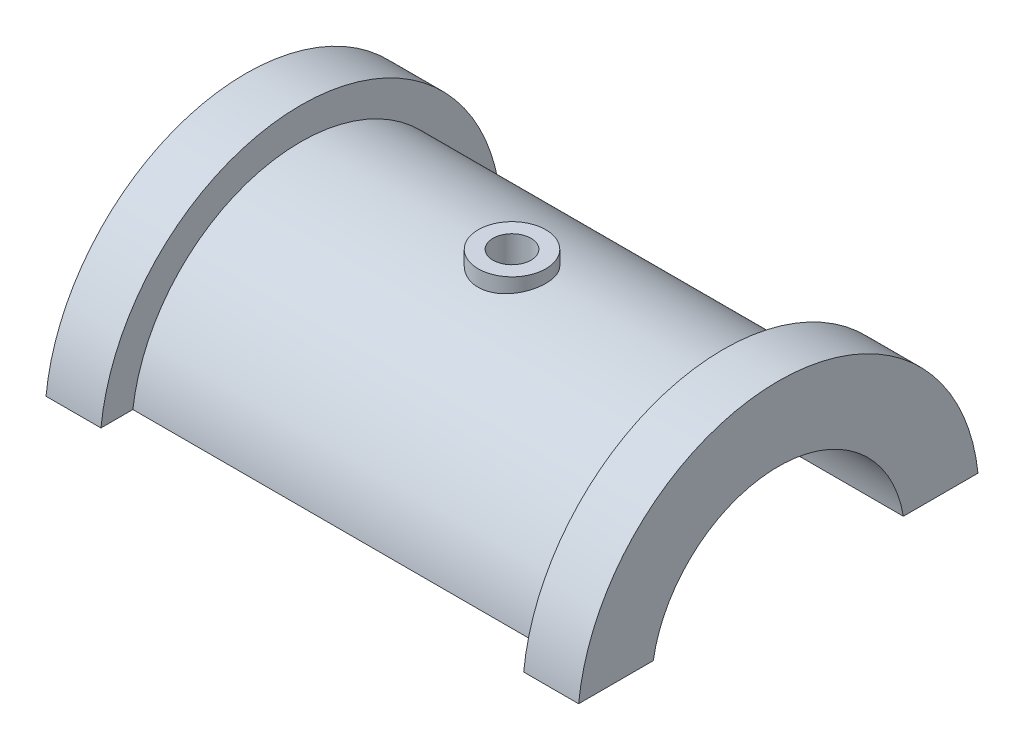
ISO-10303-21;
HEADER;
FILE_DESCRIPTION(('STEP AP214'),'2;1');
FILE_NAME('part.step','',(''),(''),'','','');
FILE_SCHEMA(('AUTOMOTIVE_DESIGN { 1 0 10303 214 1 1 1 1 }'));
ENDSEC;
DATA;
#1=APPLICATION_CONTEXT('core data for automotive mechanical design processes');
#2=APPLICATION_PROTOCOL_DEFINITION('international standard','automotive_design',2000,#1);
#3=PRODUCT_CONTEXT('',#1,'mechanical');
#4=PRODUCT('Part','Part','',(#3));
#5=PRODUCT_RELATED_PRODUCT_CATEGORY('part','',(#4));
#6=PRODUCT_DEFINITION_FORMATION('','',#4);
#7=PRODUCT_DEFINITION_CONTEXT('part definition',#1,'design');
#8=PRODUCT_DEFINITION('design','',#6,#7);
#9=PRODUCT_DEFINITION_SHAPE('','',#8);
#10=(LENGTH_UNIT() NAMED_UNIT(*) SI_UNIT(.MILLI.,.METRE.));
#11=(NAMED_UNIT(*) PLANE_ANGLE_UNIT() SI_UNIT($,.RADIAN.));
#12=(NAMED_UNIT(*) SI_UNIT($,.STERADIAN.) SOLID_ANGLE_UNIT());
#13=UNCERTAINTY_MEASURE_WITH_UNIT(LENGTH_MEASURE(1.E-05),#10,'distance_accuracy_value','');
#14=(GEOMETRIC_REPRESENTATION_CONTEXT(3) GLOBAL_UNCERTAINTY_ASSIGNED_CONTEXT((#13)) GLOBAL_UNIT_ASSIGNED_CONTEXT((#10,
#11,#12)) REPRESENTATION_CONTEXT('',''));
#15=CARTESIAN_POINT('',(0.,0.,0.));
#16=DIRECTION('',(0.,0.,1.));
#17=DIRECTION('',(1.,0.,0.));
#18=AXIS2_PLACEMENT_3D('',#15,#16,#17);
#19=CARTESIAN_POINT('',(0.,0.,0.));
#20=DIRECTION('',(-1.,0.,0.));
#21=DIRECTION('',(0.,0.,1.));
#22=AXIS2_PLACEMENT_3D('',#19,#20,#21);
#23=PLANE('',#22);
#24=CARTESIAN_POINT('',(0.,0.,0.));
#25=DIRECTION('',(1.,0.,0.));
#26=DIRECTION('',(0.,0.,-1.));
#27=AXIS2_PLACEMENT_3D('',#24,#25,#26);
#28=CIRCLE('',#27,47.5);
#29=CARTESIAN_POINT('',(0.,5.,-47.236109069228));
#30=VERTEX_POINT('',#29);
#31=CARTESIAN_POINT('',(0.,5.,47.236109069228));
#32=VERTEX_POINT('',#31);
#33=EDGE_CURVE('E135',#30,#32,#28,.T.);
#34=ORIENTED_EDGE('',*,*,#33,.F.);
#35=DIRECTION('',(0.,0.,1.));
#36=VECTOR('',#35,1.);
#37=CARTESIAN_POINT('',(0.,5.,0.));
#38=LINE('',#37,#36);
#39=CARTESIAN_POINT('',(0.,5.,-29.5803989154981));
#40=VERTEX_POINT('',#39);
#41=EDGE_CURVE('E181',#30,#40,#38,.T.);
#42=ORIENTED_EDGE('',*,*,#41,.T.);
#43=CARTESIAN_POINT('',(0.,0.,0.));
#44=DIRECTION('',(1.,0.,0.));
#45=DIRECTION('',(0.,0.,-1.));
#46=AXIS2_PLACEMENT_3D('',#43,#44,#45);
#47=CIRCLE('',#46,30.);
#48=CARTESIAN_POINT('',(0.,5.,29.5803989154981));
#49=VERTEX_POINT('',#48);
#50=EDGE_CURVE('E114',#40,#49,#47,.T.);
#51=ORIENTED_EDGE('',*,*,#50,.T.);
#52=EDGE_CURVE('E56',#49,#32,#38,.T.);
#53=ORIENTED_EDGE('',*,*,#52,.T.);
#54=EDGE_LOOP('',(#34,#42,#51,#53));
#55=FACE_BOUND('',#54,.T.);
#56=ADVANCED_FACE('F41',(#55),#23,.T.);
#57=CARTESIAN_POINT('',(126.,0.,0.));
#58=DIRECTION('',(1.,0.,0.));
#59=DIRECTION('',(0.,0.,-1.));
#60=AXIS2_PLACEMENT_3D('',#57,#58,#59);
#61=CYLINDRICAL_SURFACE('',#60,47.5);
#62=CARTESIAN_POINT('',(13.,0.,0.));
#63=DIRECTION('',(1.,0.,0.));
#64=DIRECTION('',(0.,0.,-1.));
#65=AXIS2_PLACEMENT_3D('',#62,#63,#64);
#66=CIRCLE('',#65,47.5);
#67=CARTESIAN_POINT('',(13.,5.,-47.236109069228));
#68=VERTEX_POINT('',#67);
#69=CARTESIAN_POINT('',(13.,5.,47.236109069228));
#70=VERTEX_POINT('',#69);
#71=EDGE_CURVE('E183',#68,#70,#66,.T.);
#72=ORIENTED_EDGE('',*,*,#71,.F.);
#73=DIRECTION('',(1.,0.,0.));
#74=VECTOR('',#73,1.);
#75=CARTESIAN_POINT('',(126.,5.,-47.236109069228));
#76=LINE('',#75,#74);
#77=EDGE_CURVE('E63',#68,#30,#76,.F.);
#78=ORIENTED_EDGE('',*,*,#77,.T.);
#79=ORIENTED_EDGE('',*,*,#33,.T.);
#80=DIRECTION('',(1.,0.,0.));
#81=VECTOR('',#80,1.);
#82=CARTESIAN_POINT('',(126.,5.,47.236109069228));
#83=LINE('',#82,#81);
#84=EDGE_CURVE('E200',#32,#70,#83,.T.);
#85=ORIENTED_EDGE('',*,*,#84,.T.);
#86=EDGE_LOOP('',(#72,#78,#79,#85));
#87=FACE_BOUND('',#86,.T.);
#88=ADVANCED_FACE('F175',(#87),#61,.T.);
#89=CARTESIAN_POINT('',(13.,47.5,0.));
#90=DIRECTION('',(1.,0.,0.));
#91=DIRECTION('',(0.,0.,-1.));
#92=AXIS2_PLACEMENT_3D('',#89,#90,#91);
#93=PLANE('',#92);
#94=ORIENTED_EDGE('',*,*,#71,.T.);
#95=DIRECTION('',(0.,0.,-1.));
#96=VECTOR('',#95,1.);
#97=CARTESIAN_POINT('',(13.,5.,0.));
#98=LINE('',#97,#96);
#99=CARTESIAN_POINT('',(13.,5.,39.6862696659689));
#100=VERTEX_POINT('',#99);
#101=EDGE_CURVE('E204',#70,#100,#98,.T.);
#102=ORIENTED_EDGE('',*,*,#101,.T.);
#103=CARTESIAN_POINT('',(13.,0.,0.));
#104=DIRECTION('',(1.,0.,0.));
#105=DIRECTION('',(0.,0.,-1.));
#106=AXIS2_PLACEMENT_3D('',#103,#104,#105);
#107=CIRCLE('',#106,40.);
#108=CARTESIAN_POINT('',(13.,5.,-39.6862696659689));
#109=VERTEX_POINT('',#108);
#110=EDGE_CURVE('E230',#109,#100,#107,.T.);
#111=ORIENTED_EDGE('',*,*,#110,.F.);
#112=EDGE_CURVE('E195',#109,#68,#98,.T.);
#113=ORIENTED_EDGE('',*,*,#112,.T.);
#114=EDGE_LOOP('',(#94,#102,#111,#113));
#115=FACE_BOUND('',#114,.T.);
#116=ADVANCED_FACE('F171',(#115),#93,.T.);
#117=CARTESIAN_POINT('',(126.,0.,0.));
#118=DIRECTION('',(1.,0.,0.));
#119=DIRECTION('',(0.,0.,-1.));
#120=AXIS2_PLACEMENT_3D('',#117,#118,#119);
#121=CYLINDRICAL_SURFACE('',#120,40.);
#122=CARTESIAN_POINT('',(63.,39.1918358845308,8.00000000000001));
#123=CARTESIAN_POINT('',(63.2223321756335,39.1918334625397,8.00000444680971));
#124=CARTESIAN_POINT('',(63.444608835908,39.1937313091331,7.99072915847732));
#125=CARTESIAN_POINT('',(63.8876218461611,39.2012611241478,7.95371066865297));
#126=CARTESIAN_POINT('',(64.1083579293486,39.2068937238825,7.92596434485907));
#127=CARTESIAN_POINT('',(64.5467426101618,39.2217334401668,7.85219908282773));
#128=CARTESIAN_POINT('',(64.7643895368724,39.2309424201119,7.80617061879168));
#129=CARTESIAN_POINT('',(65.1950222828236,39.2526669640111,7.69618591324899));
#130=CARTESIAN_POINT('',(65.4080063551147,39.2651837450381,7.63222307243574));
#131=CARTESIAN_POINT('',(65.8274493151029,39.2931385131023,7.48697016044798));
#132=CARTESIAN_POINT('',(66.0339168198237,39.3085724361382,7.40570417536749));
#133=CARTESIAN_POINT('',(66.4392998991448,39.3419363650496,7.2263655796773));
#134=CARTESIAN_POINT('',(66.6382126172714,39.3598673033238,7.12828668786425));
#135=CARTESIAN_POINT('',(67.0269733163436,39.397704240132,6.91610452763907));
#136=CARTESIAN_POINT('',(67.2168256648899,39.4176092725028,6.80200908681326));
#137=CARTESIAN_POINT('',(67.5863976292983,39.45885578746,6.55850211762383));
#138=CARTESIAN_POINT('',(67.7661125744652,39.4801979224,6.42908361306728));
#139=CARTESIAN_POINT('',(68.1163475643129,39.5239982537687,6.15411905829398));
#140=CARTESIAN_POINT('',(68.2867219720539,39.5464671767086,6.00838917838245));
#141=CARTESIAN_POINT('',(68.6145558470776,39.5916264198183,5.70323504369133));
#142=CARTESIAN_POINT('',(68.7720209523236,39.6143166384428,5.54381683006104));
#143=CARTESIAN_POINT('',(69.0731255690904,39.6593075766281,5.21222816318059));
#144=CARTESIAN_POINT('',(69.2167585566595,39.6816081083725,5.04005175958521));
#145=CARTESIAN_POINT('',(69.4890779153666,39.7251817805114,4.68423328108786));
#146=CARTESIAN_POINT('',(69.6177695234903,39.7464552793466,4.50059525841972));
#147=CARTESIAN_POINT('',(69.8604385628062,39.7875757512423,4.12134830205592));
#148=CARTESIAN_POINT('',(69.9742743191797,39.8074082874115,3.9256471048012));
#149=CARTESIAN_POINT('',(70.1850268139663,39.8448723364328,3.52513751300382));
#150=CARTESIAN_POINT('',(70.2819438193739,39.8625038840172,3.32032926224338));
#151=CARTESIAN_POINT('',(70.4581198398941,39.8950630092,2.90305593566496));
#152=CARTESIAN_POINT('',(70.53737974556,39.9099907231617,2.69059124663517));
#153=CARTESIAN_POINT('',(70.6776238263456,39.9367144918616,2.25952656075932));
#154=CARTESIAN_POINT('',(70.7386086427421,39.9485106564848,2.04092677948937));
#155=CARTESIAN_POINT('',(70.8411442200041,39.968500666972,1.60205405924747));
#156=CARTESIAN_POINT('',(70.8829370426857,39.9767392987482,1.38183970161488));
#157=CARTESIAN_POINT('',(70.9478964723546,39.9895991805319,0.938658138720008));
#158=CARTESIAN_POINT('',(70.9710700229672,39.9942217790381,0.71569199120012));
#159=CARTESIAN_POINT('',(70.9986294212179,39.9997236189696,0.268533421487429));
#160=CARTESIAN_POINT('',(71.0030134240166,40.0006024928197,0.0443408810457438));
#161=CARTESIAN_POINT('',(70.9929526451097,39.9985908186422,-0.403603341337231));
#162=CARTESIAN_POINT('',(70.9785080101147,39.9957002999853,-0.62735502670001));
#163=CARTESIAN_POINT('',(70.9312528162061,39.9863007335844,-1.06956007208301));
#164=CARTESIAN_POINT('',(70.898710480689,39.9798445416014,-1.28804328418386));
#165=CARTESIAN_POINT('',(70.815693779263,39.9635260481262,-1.72152458521656));
#166=CARTESIAN_POINT('',(70.7652131936329,39.9536625652588,-1.93652143825458));
#167=CARTESIAN_POINT('',(70.6467312731468,39.9308042118727,-2.36138127795778));
#168=CARTESIAN_POINT('',(70.578735799815,39.9178103890461,-2.57124595647658));
#169=CARTESIAN_POINT('',(70.4256993844492,39.8890381591941,-2.98455504865933));
#170=CARTESIAN_POINT('',(70.3406521030243,39.8732587168138,-3.18799704189115));
#171=CARTESIAN_POINT('',(70.1535815531641,39.8392422414482,-3.58822554317844));
#172=CARTESIAN_POINT('',(70.0514580411962,39.8209908249741,-3.78496396602225));
#173=CARTESIAN_POINT('',(69.8313331372257,39.7826013735344,-4.16916132193276));
#174=CARTESIAN_POINT('',(69.7133311706324,39.7624632703036,-4.35661991885613));
#175=CARTESIAN_POINT('',(69.4622650477018,39.7208452652347,-4.72102648822367));
#176=CARTESIAN_POINT('',(69.3291996857128,39.6993652560542,-4.89797361761499));
#177=CARTESIAN_POINT('',(69.0489183958665,39.6556459734977,-5.24018167605238));
#178=CARTESIAN_POINT('',(68.9017023042098,39.633406691335,-5.4054424697869));
#179=CARTESIAN_POINT('',(68.5914120240961,39.5883811586584,-5.72596974492621));
#180=CARTESIAN_POINT('',(68.4281058067676,39.5655921383058,-5.88101130801579));
#181=CARTESIAN_POINT('',(68.0889749342266,39.5204937891078,-6.17680825803358));
#182=CARTESIAN_POINT('',(67.9131505079723,39.4981844514987,-6.31756390613739));
#183=CARTESIAN_POINT('',(67.5501298503129,39.4546728448073,-6.58384395745569));
#184=CARTESIAN_POINT('',(67.3629310294606,39.4334708298717,-6.70936487275157));
#185=CARTESIAN_POINT('',(66.9785465601245,39.3927954039874,-6.94419699330226));
#186=CARTESIAN_POINT('',(66.7813647422252,39.3733213377838,-7.05351435373698));
#187=CARTESIAN_POINT('',(66.3777946736904,39.3366117286613,-7.25544915790509));
#188=CARTESIAN_POINT('',(66.171384356556,39.3193819842128,-7.34802357467671));
#189=CARTESIAN_POINT('',(65.7513534289703,39.287734887423,-7.5153938362461));
#190=CARTESIAN_POINT('',(65.5377354634626,39.2733165162983,-7.59019612345057));
#191=CARTESIAN_POINT('',(65.1047331866939,39.2477157945947,-7.72148193065287));
#192=CARTESIAN_POINT('',(64.8853484356048,39.2365336916291,-7.77796404897822));
#193=CARTESIAN_POINT('',(64.4424332263762,39.2177468212383,-7.87214359315173));
#194=CARTESIAN_POINT('',(64.2189028350496,39.2101419962123,-7.90984132146431));
#195=CARTESIAN_POINT('',(63.7732050538516,39.1988401365669,-7.96565933677234));
#196=CARTESIAN_POINT('',(63.5510798499128,39.1950784266016,-7.98410375513831));
#197=CARTESIAN_POINT('',(63.106033935144,39.1913476849508,-8.0023968461039));
#198=CARTESIAN_POINT('',(62.8831132322512,39.1913786155281,-8.0022457037312));
#199=CARTESIAN_POINT('',(62.4381071421417,39.1952321147503,-7.98334963144252));
#200=CARTESIAN_POINT('',(62.2160217105626,39.1990544790899,-7.96460570341782));
#201=CARTESIAN_POINT('',(61.7742810037128,39.2103766066046,-7.90867741066269));
#202=CARTESIAN_POINT('',(61.5546257232514,39.2178763619237,-7.87149308532674));
#203=CARTESIAN_POINT('',(61.1214518779295,39.236240519964,-7.77943482948001));
#204=CARTESIAN_POINT('',(60.9078942926771,39.2470712742881,-7.72473759003573));
#205=CARTESIAN_POINT('',(60.4861106947254,39.2718130151192,-7.59795179367917));
#206=CARTESIAN_POINT('',(60.2778865269745,39.2857250518757,-7.52585730619399));
#207=CARTESIAN_POINT('',(59.86832010563,39.3162271950907,-7.36484795633877));
#208=CARTESIAN_POINT('',(59.6669759242795,39.3328165437915,-7.27593785206036));
#209=CARTESIAN_POINT('',(59.272381200041,39.3682169806381,-7.08189353673638));
#210=CARTESIAN_POINT('',(59.0791335525388,39.3870288545441,-6.9767535836758));
#211=CARTESIAN_POINT('',(58.6996498158305,39.4266019269176,-6.74955710289022));
#212=CARTESIAN_POINT('',(58.513535808138,39.4473850769299,-6.62730047099552));
#213=CARTESIAN_POINT('',(58.1522264276141,39.4901091488608,-6.36777572580048));
#214=CARTESIAN_POINT('',(57.9770312061261,39.5120500868195,-6.23050740449844));
#215=CARTESIAN_POINT('',(57.6386788791504,39.5564864944536,-5.94185978392723));
#216=CARTESIAN_POINT('',(57.4755247651194,39.5789821000894,-5.79047699910403));
#217=CARTESIAN_POINT('',(57.162436340226,39.6238961799814,-5.47469375684461));
#218=CARTESIAN_POINT('',(57.0124979112311,39.6463146761582,-5.31029738509047));
#219=CARTESIAN_POINT('',(56.7245669025983,39.6908114021731,-4.96688279801154));
#220=CARTESIAN_POINT('',(56.5867963171702,39.7128789212228,-4.78767697548575));
#221=CARTESIAN_POINT('',(56.3268441846796,39.7556859639914,-4.41814700095319));
#222=CARTESIAN_POINT('',(56.2046624725018,39.7764255017748,-4.22782296674027));
#223=CARTESIAN_POINT('',(55.9767722477412,39.8159908860153,-3.83736479359661));
#224=CARTESIAN_POINT('',(55.8710636510933,39.8348167422381,-3.63723070473507));
#225=CARTESIAN_POINT('',(55.67691223777,39.8700200050484,-3.22855396209364));
#226=CARTESIAN_POINT('',(55.5884688581965,39.8863974914561,-3.02001158271699));
#227=CARTESIAN_POINT('',(55.4299669944458,39.9161542481918,-2.5971707431593));
#228=CARTESIAN_POINT('',(55.3598091817034,39.9295496568498,-2.38291066058593));
#229=CARTESIAN_POINT('',(55.2378115869592,39.9530722705058,-1.9491458974506));
#230=CARTESIAN_POINT('',(55.1859649850127,39.9632006921592,-1.72964320206956));
#231=CARTESIAN_POINT('',(55.1009670516496,39.979907233652,-1.28689374949739));
#232=CARTESIAN_POINT('',(55.067817302387,39.9864850530324,-1.06364667709731));
#233=CARTESIAN_POINT('',(55.0204920139186,39.9958998852379,-0.615072950022916));
#234=CARTESIAN_POINT('',(55.006316221449,39.9987369479946,-0.38974632314684));
#235=CARTESIAN_POINT('',(54.9971365507353,40.0005725685462,0.057342242183656));
#236=CARTESIAN_POINT('',(55.0017997225373,39.9996377882729,0.279097141768122));
#237=CARTESIAN_POINT('',(55.0295174180757,39.9941046686454,0.721486558729148));
#238=CARTESIAN_POINT('',(55.0525783338512,39.9895050559971,0.942120659883184));
#239=CARTESIAN_POINT('',(55.1169091416906,39.9767698778396,1.38056597737014));
#240=CARTESIAN_POINT('',(55.1581752436429,39.9686350483274,1.59837777156445));
#241=CARTESIAN_POINT('',(55.2585928110868,39.9490545945851,2.02969087993137));
#242=CARTESIAN_POINT('',(55.3177447246962,39.9376088874034,2.24319208596193));
#243=CARTESIAN_POINT('',(55.4533216330723,39.9117519105193,2.66390281610611));
#244=CARTESIAN_POINT('',(55.5297063285804,39.8973475665856,2.87112575977153));
#245=CARTESIAN_POINT('',(55.6992579934174,39.8659490992443,3.27838682247713));
#246=CARTESIAN_POINT('',(55.7924252633769,39.8489549294453,3.47842481273433));
#247=CARTESIAN_POINT('',(55.9948565343959,39.8128386654258,3.86995196753948));
#248=CARTESIAN_POINT('',(56.1041187600176,39.793716805968,4.06144207197445));
#249=CARTESIAN_POINT('',(56.3380191356876,39.7538515091122,4.43469676676205));
#250=CARTESIAN_POINT('',(56.4626623419565,39.7331075392998,4.616458130663));
#251=CARTESIAN_POINT('',(56.7285562146262,39.6902194995578,4.97182275164247));
#252=CARTESIAN_POINT('',(56.8700404202478,39.6680583543292,5.14524924859913));
#253=CARTESIAN_POINT('',(57.1670019944219,39.6232548785426,5.47961055337561));
#254=CARTESIAN_POINT('',(57.322479504572,39.6006125431173,5.64054523476049));
#255=CARTESIAN_POINT('',(57.6464423507613,39.5554654612821,5.94890319793123));
#256=CARTESIAN_POINT('',(57.8149329585349,39.5329607746618,6.09632095041954));
#257=CARTESIAN_POINT('',(58.1636747284677,39.4887343722211,6.37651738391804));
#258=CARTESIAN_POINT('',(58.3439217864996,39.4670123872305,6.50930113051804));
#259=CARTESIAN_POINT('',(58.7170963591136,39.4247197054883,6.76076328463175));
#260=CARTESIAN_POINT('',(58.910142985973,39.4041645714432,6.87926764553854));
#261=CARTESIAN_POINT('',(59.3056713792041,39.3650778141222,7.09951821043143));
#262=CARTESIAN_POINT('',(59.5081496349157,39.3465454463808,7.20127058692977));
#263=CARTESIAN_POINT('',(59.9210737849384,39.3120529699356,7.38724870626153));
#264=CARTESIAN_POINT('',(60.1315147300782,39.2960912948383,7.47148513122491));
#265=CARTESIAN_POINT('',(60.5589023969144,39.2672059266166,7.62183556720192));
#266=CARTESIAN_POINT('',(60.7758478508904,39.2542816457923,7.68795308442215));
#267=CARTESIAN_POINT('',(61.3219483015617,39.2263906298773,7.82929467339841));
#268=CARTESIAN_POINT('',(61.6542047229136,39.2135042282173,7.89322138931694));
#269=CARTESIAN_POINT('',(62.3243502668962,39.1962288417274,7.97856994221241));
#270=CARTESIAN_POINT('',(62.6622391949362,39.1918395639518,7.99999324453145));
#271=CARTESIAN_POINT('',(63.,39.1918358845308,8.00000000000001));
#272=B_SPLINE_CURVE_WITH_KNOTS('',3,(#122,#123,#124,#125,#126,#127,#128,#129,#130,#131,#132,
#133,#134,#135,#136,#137,#138,#139,#140,#141,#142,#143,#144,#145,#146,#147,#148,#149,#150,#151,
#152,#153,#154,#155,#156,#157,#158,#159,#160,#161,#162,#163,#164,#165,#166,#167,#168,#169,#170,
#171,#172,#173,#174,#175,#176,#177,#178,#179,#180,#181,#182,#183,#184,#185,#186,#187,#188,#189,
#190,#191,#192,#193,#194,#195,#196,#197,#198,#199,#200,#201,#202,#203,#204,#205,#206,#207,#208,
#209,#210,#211,#212,#213,#214,#215,#216,#217,#218,#219,#220,#221,#222,#223,#224,#225,#226,#227,
#228,#229,#230,#231,#232,#233,#234,#235,#236,#237,#238,#239,#240,#241,#242,#243,#244,#245,#246,
#247,#248,#249,#250,#251,#252,#253,#254,#255,#256,#257,#258,#259,#260,#261,#262,#263,#264,#265,
#266,#267,#268,#269,#270,#271),.UNSPECIFIED.,.T.,.F.,(4,2,2,2,2,2,2,2,2,2,2,2,2,2,2,2,2,2,2,2,2,
2,2,2,2,2,2,2,2,2,2,2,2,2,2,2,2,2,2,2,2,2,2,2,2,2,2,2,2,2,2,2,2,2,2,2,2,2,2,2,2,2,2,2,2,2,2,2,2,
2,2,2,2,2,4),(0.,0.66669962080922,1.33351196763623,2.00067220974087,2.6680782694827,
3.33456129926917,4.00129386803293,4.66770171927308,5.33441414385644,6.00958778201576,
6.68446495869508,7.35965889967107,8.03461546466403,8.71559997574724,9.39657373925776,
10.0775131494084,10.758428662454,11.4305027443343,12.1023260753042,12.7742153672942,
13.4460994240273,14.1082812048319,14.7706928080069,15.4328830161807,16.0953198663876,
16.7617915394051,17.4282873364011,18.0948365164921,18.761393413035,19.4395899828794,
20.1177741516753,20.7961132957513,21.4741940978061,22.1539934485735,22.8335459944277,
23.513150520455,24.1927441032028,24.8607025024088,25.5286542553628,26.1965700170081,
26.8644843517822,27.5258617659394,28.1874649572828,28.8488812228827,29.5105320318643,
30.1806891108884,30.8508554767744,31.5211877802068,32.1913104577718,32.8718527668964,
33.5523878672035,34.2329194945118,34.9134289307254,35.5901608876029,36.2666405316387,
36.943177411752,37.6197052613858,38.2843292875131,38.9491843285899,39.6139010197189,
40.2786343662833,40.941829042019,41.605035598918,42.268169052074,42.9315210820594,
43.6054724763124,44.2794306910234,44.9536633795958,45.6276619432675,46.3091860184527,
46.9904584114241,47.671314102898,48.3520379481715,49.3649042320086,50.3777355957941),.UNSPECIFIED.);
#273=CARTESIAN_POINT('',(63.,39.1918358845308,8.00000000000001));
#274=VERTEX_POINT('',#273);
#275=EDGE_CURVE('E132',#274,#274,#272,.T.);
#276=ORIENTED_EDGE('',*,*,#275,.F.);
#277=EDGE_LOOP('',(#276));
#278=FACE_BOUND('',#277,.T.);
#279=CARTESIAN_POINT('',(113.,0.,0.));
#280=DIRECTION('',(1.,0.,0.));
#281=DIRECTION('',(0.,0.,-1.));
#282=AXIS2_PLACEMENT_3D('',#279,#280,#281);
#283=CIRCLE('',#282,40.);
#284=CARTESIAN_POINT('',(113.,5.,-39.6862696659689));
#285=VERTEX_POINT('',#284);
#286=CARTESIAN_POINT('',(113.,5.,39.6862696659689));
#287=VERTEX_POINT('',#286);
#288=EDGE_CURVE('E226',#285,#287,#283,.T.);
#289=ORIENTED_EDGE('',*,*,#288,.F.);
#290=DIRECTION('',(1.,0.,0.));
#291=VECTOR('',#290,1.);
#292=CARTESIAN_POINT('',(126.,5.,-39.6862696659689));
#293=LINE('',#292,#291);
#294=EDGE_CURVE('E242',#285,#109,#293,.F.);
#295=ORIENTED_EDGE('',*,*,#294,.T.);
#296=ORIENTED_EDGE('',*,*,#110,.T.);
#297=DIRECTION('',(1.,0.,0.));
#298=VECTOR('',#297,1.);
#299=CARTESIAN_POINT('',(126.,5.,39.6862696659689));
#300=LINE('',#299,#298);
#301=EDGE_CURVE('E207',#100,#287,#300,.T.);
#302=ORIENTED_EDGE('',*,*,#301,.T.);
#303=EDGE_LOOP('',(#289,#295,#296,#302));
#304=FACE_BOUND('',#303,.T.);
#305=ADVANCED_FACE('F144',(#278,#304),#121,.T.);
#306=CARTESIAN_POINT('',(113.,40.,0.));
#307=DIRECTION('',(-1.,0.,0.));
#308=DIRECTION('',(0.,0.,1.));
#309=AXIS2_PLACEMENT_3D('',#306,#307,#308);
#310=PLANE('',#309);
#311=CARTESIAN_POINT('',(113.,0.,0.));
#312=DIRECTION('',(1.,0.,0.));
#313=DIRECTION('',(0.,0.,-1.));
#314=AXIS2_PLACEMENT_3D('',#311,#312,#313);
#315=CIRCLE('',#314,47.5);
#316=CARTESIAN_POINT('',(113.,5.,-47.236109069228));
#317=VERTEX_POINT('',#316);
#318=CARTESIAN_POINT('',(113.,5.,47.236109069228));
#319=VERTEX_POINT('',#318);
#320=EDGE_CURVE('E219',#317,#319,#315,.T.);
#321=ORIENTED_EDGE('',*,*,#320,.F.);
#322=DIRECTION('',(0.,0.,1.));
#323=VECTOR('',#322,1.);
#324=CARTESIAN_POINT('',(113.,5.,0.));
#325=LINE('',#324,#323);
#326=EDGE_CURVE('E215',#317,#285,#325,.T.);
#327=ORIENTED_EDGE('',*,*,#326,.T.);
#328=ORIENTED_EDGE('',*,*,#288,.T.);
#329=EDGE_CURVE('E212',#287,#319,#325,.T.);
#330=ORIENTED_EDGE('',*,*,#329,.T.);
#331=EDGE_LOOP('',(#321,#327,#328,#330));
#332=FACE_BOUND('',#331,.T.);
#333=ADVANCED_FACE('F164',(#332),#310,.T.);
#334=CARTESIAN_POINT('',(126.,0.,0.));
#335=DIRECTION('',(1.,0.,0.));
#336=DIRECTION('',(0.,0.,-1.));
#337=AXIS2_PLACEMENT_3D('',#334,#335,#336);
#338=CYLINDRICAL_SURFACE('',#337,47.5);
#339=CARTESIAN_POINT('',(126.,0.,0.));
#340=DIRECTION('',(1.,0.,0.));
#341=DIRECTION('',(0.,0.,-1.));
#342=AXIS2_PLACEMENT_3D('',#339,#340,#341);
#343=CIRCLE('',#342,47.5);
#344=CARTESIAN_POINT('',(126.,5.,-47.236109069228));
#345=VERTEX_POINT('',#344);
#346=CARTESIAN_POINT('',(126.,5.,47.236109069228));
#347=VERTEX_POINT('',#346);
#348=EDGE_CURVE('E122',#345,#347,#343,.T.);
#349=ORIENTED_EDGE('',*,*,#348,.F.);
#350=DIRECTION('',(1.,0.,0.));
#351=VECTOR('',#350,1.);
#352=CARTESIAN_POINT('',(126.,5.,-47.236109069228));
#353=LINE('',#352,#351);
#354=EDGE_CURVE('E203',#345,#317,#353,.F.);
#355=ORIENTED_EDGE('',*,*,#354,.T.);
#356=ORIENTED_EDGE('',*,*,#320,.T.);
#357=DIRECTION('',(1.,0.,0.));
#358=VECTOR('',#357,1.);
#359=CARTESIAN_POINT('',(126.,5.,47.236109069228));
#360=LINE('',#359,#358);
#361=EDGE_CURVE('E126',#319,#347,#360,.T.);
#362=ORIENTED_EDGE('',*,*,#361,.T.);
#363=EDGE_LOOP('',(#349,#355,#356,#362));
#364=FACE_BOUND('',#363,.T.);
#365=ADVANCED_FACE('F162',(#364),#338,.T.);
#366=CARTESIAN_POINT('',(126.,47.5,0.));
#367=DIRECTION('',(1.,0.,0.));
#368=DIRECTION('',(0.,0.,-1.));
#369=AXIS2_PLACEMENT_3D('',#366,#367,#368);
#370=PLANE('',#369);
#371=ORIENTED_EDGE('',*,*,#348,.T.);
#372=DIRECTION('',(0.,0.,-1.));
#373=VECTOR('',#372,1.);
#374=CARTESIAN_POINT('',(126.,5.,0.));
#375=LINE('',#374,#373);
#376=CARTESIAN_POINT('',(126.,5.,29.5803989154981));
#377=VERTEX_POINT('',#376);
#378=EDGE_CURVE('E119',#347,#377,#375,.T.);
#379=ORIENTED_EDGE('',*,*,#378,.T.);
#380=CARTESIAN_POINT('',(126.,0.,0.));
#381=DIRECTION('',(1.,0.,0.));
#382=DIRECTION('',(0.,0.,-1.));
#383=AXIS2_PLACEMENT_3D('',#380,#381,#382);
#384=CIRCLE('',#383,30.);
#385=CARTESIAN_POINT('',(126.,5.,-29.5803989154981));
#386=VERTEX_POINT('',#385);
#387=EDGE_CURVE('E107',#386,#377,#384,.T.);
#388=ORIENTED_EDGE('',*,*,#387,.F.);
#389=EDGE_CURVE('E128',#386,#345,#375,.T.);
#390=ORIENTED_EDGE('',*,*,#389,.T.);
#391=EDGE_LOOP('',(#371,#379,#388,#390));
#392=FACE_BOUND('',#391,.T.);
#393=ADVANCED_FACE('F120',(#392),#370,.T.);
#394=CARTESIAN_POINT('',(0.,0.,0.));
#395=DIRECTION('',(1.,0.,0.));
#396=DIRECTION('',(0.,0.,-1.));
#397=AXIS2_PLACEMENT_3D('',#394,#395,#396);
#398=CYLINDRICAL_SURFACE('',#397,30.);
#399=CARTESIAN_POINT('',(63.,29.6605798999278,4.49999999999999));
#400=CARTESIAN_POINT('',(63.2512367078926,29.6605840995083,4.4999896232169));
#401=CARTESIAN_POINT('',(63.5026192523197,29.6638065495494,4.47888889164195));
#402=CARTESIAN_POINT('',(63.9983559447118,29.6763394413827,4.39506589969728));
#403=CARTESIAN_POINT('',(64.2427029944524,29.6856558212155,4.33230304207741));
#404=CARTESIAN_POINT('',(64.7171212663187,29.7092981703132,4.16707578294728));
#405=CARTESIAN_POINT('',(64.9472032876206,29.7236202941407,4.06464185044318));
#406=CARTESIAN_POINT('',(65.3868810923221,29.7556558231997,3.82305189263246));
#407=CARTESIAN_POINT('',(65.5964796906445,29.7733687614577,3.68390092289581));
#408=CARTESIAN_POINT('',(65.9909514502614,29.8103486774939,3.3716370725571));
#409=CARTESIAN_POINT('',(66.1756368402198,29.8296258737559,3.19828816754469));
#410=CARTESIAN_POINT('',(66.5134124569669,29.8674710450573,2.82305881633302));
#411=CARTESIAN_POINT('',(66.6665009465011,29.8860389810546,2.62117680235956));
#412=CARTESIAN_POINT('',(66.937429895074,29.9204804228494,2.19340907415825));
#413=CARTESIAN_POINT('',(67.0550974509673,29.9363405530681,1.9674126820973));
#414=CARTESIAN_POINT('',(67.2507347964245,29.9634662023911,1.49858655032091));
#415=CARTESIAN_POINT('',(67.3287066835287,29.9747319642581,1.25575770081203));
#416=CARTESIAN_POINT('',(67.4421701655925,29.9913274439337,0.762093369271709));
#417=CARTESIAN_POINT('',(67.4779761791615,29.9967010766204,0.5113316531696));
#418=CARTESIAN_POINT('',(67.5070678044747,30.0010573430875,0.00730561205843967));
#419=CARTESIAN_POINT('',(67.5003557799591,30.0000403321482,-0.245958573047235));
#420=CARTESIAN_POINT('',(67.4448499867127,29.9917649898239,-0.745655154601551));
#421=CARTESIAN_POINT('',(67.3963944846255,29.9845568295744,-0.992126074200013));
#422=CARTESIAN_POINT('',(67.2593081810323,29.9647650068355,-1.4733984874294));
#423=CARTESIAN_POINT('',(67.1706763454957,29.9521812059922,-1.70819968054043));
#424=CARTESIAN_POINT('',(66.9554070092487,29.9229658161962,-2.16049134231094));
#425=CARTESIAN_POINT('',(66.8286271046738,29.9063191054691,-2.37791301697077));
#426=CARTESIAN_POINT('',(66.54076441899,29.8708331473626,-2.78852372145052));
#427=CARTESIAN_POINT('',(66.3796793798794,29.8519937556955,-2.98171115481519));
#428=CARTESIAN_POINT('',(66.0258946535202,29.8140047457788,-3.34036344816792));
#429=CARTESIAN_POINT('',(65.8328996340897,29.7948538986977,-3.50553698852838));
#430=CARTESIAN_POINT('',(65.4217767686288,29.7585811336057,-3.80119798016437));
#431=CARTESIAN_POINT('',(65.2036487678402,29.7414592280895,-3.93168521783995));
#432=CARTESIAN_POINT('',(64.7481481111781,29.7111832586057,-4.15430893603813));
#433=CARTESIAN_POINT('',(64.5107605990128,29.6980322953587,-4.24641546810243));
#434=CARTESIAN_POINT('',(64.0236442345578,29.6772420869718,-4.38937008626636));
#435=CARTESIAN_POINT('',(63.7739162533598,29.669602453389,-4.44022108011977));
#436=CARTESIAN_POINT('',(63.2717997312675,29.6607735418508,-4.49882160259965));
#437=CARTESIAN_POINT('',(63.0194604353954,29.6595224640772,-4.50698409795156));
#438=CARTESIAN_POINT('',(62.517017415548,29.6634482381146,-4.48107171059456));
#439=CARTESIAN_POINT('',(62.2669136224477,29.6686248904733,-4.44699813846906));
#440=CARTESIAN_POINT('',(61.7773205461031,29.6847660738436,-4.33793108858298));
#441=CARTESIAN_POINT('',(61.5377843851752,29.6957014944857,-4.26314335583462));
#442=CARTESIAN_POINT('',(61.0746477238542,29.722104054773,-4.07498495841259));
#443=CARTESIAN_POINT('',(60.8510480111154,29.7375714182153,-3.96161238829167));
#444=CARTESIAN_POINT('',(60.4242802189949,29.7714406706119,-3.6985103398597));
#445=CARTESIAN_POINT('',(60.2212786581606,29.7898637783996,-3.54851353685298));
#446=CARTESIAN_POINT('',(59.8431814203786,29.8275047830006,-3.21679250511604));
#447=CARTESIAN_POINT('',(59.6680873224566,29.8467227247088,-3.03506648234039));
#448=CARTESIAN_POINT('',(59.3492921800993,29.8839811565216,-2.64322685888455));
#449=CARTESIAN_POINT('',(59.2058648152726,29.9020105038127,-2.43288938031587));
#450=CARTESIAN_POINT('',(58.9563812842121,29.9346871509605,-1.99086624079104));
#451=CARTESIAN_POINT('',(58.8503240956049,29.9493345433369,-1.75918116408132));
#452=CARTESIAN_POINT('',(58.6790287725359,29.9735480898238,-1.28189398758344));
#453=CARTESIAN_POINT('',(58.6136409987649,29.9831328515369,-1.03634657626291));
#454=CARTESIAN_POINT('',(58.5250563613876,29.9962192997069,-0.537602446503582));
#455=CARTESIAN_POINT('',(58.5018567112526,29.9997213879243,-0.284406234391743));
#456=CARTESIAN_POINT('',(58.4983748863518,30.000243871774,0.219793772582442));
#457=CARTESIAN_POINT('',(58.517673957369,29.9973275107131,0.470794710636126));
#458=CARTESIAN_POINT('',(58.5977441652623,29.9854683155751,0.965939385969331));
#459=CARTESIAN_POINT('',(58.6585151694258,29.976525500783,1.21008314518961));
#460=CARTESIAN_POINT('',(58.8196556267106,29.9536136022709,1.6844681231389));
#461=CARTESIAN_POINT('',(58.9199960854162,29.9396481994971,1.91471937944605));
#462=CARTESIAN_POINT('',(59.15738246395,29.9082250348763,2.35518335369009));
#463=CARTESIAN_POINT('',(59.2944295754432,29.8907671596523,2.5653954207632));
#464=CARTESIAN_POINT('',(59.6028530964853,29.8540953190428,2.96193775557477));
#465=CARTESIAN_POINT('',(59.7745386774407,29.8348664526187,3.14802619933503));
#466=CARTESIAN_POINT('',(60.1467152192498,29.7969300508296,3.48890425171213));
#467=CARTESIAN_POINT('',(60.3472129315043,29.7782226388846,3.64368650398485));
#468=CARTESIAN_POINT('',(60.7726469496709,29.7433345202739,3.91833932467685));
#469=CARTESIAN_POINT('',(60.997714250958,29.7271686024667,4.03800882868384));
#470=CARTESIAN_POINT('',(61.4648903301814,29.6993672711643,4.23766841610924));
#471=CARTESIAN_POINT('',(61.7069811235448,29.6877271588058,4.3176996772349));
#472=CARTESIAN_POINT('',(62.1251323087847,29.6729845660442,4.417648556708));
#473=CARTESIAN_POINT('',(62.2986101907787,29.66835748145,4.44848309341412));
#474=CARTESIAN_POINT('',(62.6480348751971,29.6621536970317,4.48966231729569));
#475=CARTESIAN_POINT('',(62.8239816455905,29.6605769576696,4.5000072700534));
#476=CARTESIAN_POINT('',(63.,29.6605798999278,4.49999999999999));
#477=B_SPLINE_CURVE_WITH_KNOTS('',3,(#399,#400,#401,#402,#403,#404,#405,#406,#407,#408,#409,
#410,#411,#412,#413,#414,#415,#416,#417,#418,#419,#420,#421,#422,#423,#424,#425,#426,#427,#428,
#429,#430,#431,#432,#433,#434,#435,#436,#437,#438,#439,#440,#441,#442,#443,#444,#445,#446,#447,
#448,#449,#450,#451,#452,#453,#454,#455,#456,#457,#458,#459,#460,#461,#462,#463,#464,#465,#466,
#467,#468,#469,#470,#471,#472,#473,#474,#475,#476),.UNSPECIFIED.,.T.,.F.,(4,2,2,2,2,2,2,2,2,2,2,
2,2,2,2,2,2,2,2,2,2,2,2,2,2,2,2,2,2,2,2,2,2,2,2,2,2,2,4),(0.,0.753066755447145,1.50686840874857,
2.26009225607017,3.01321244604714,3.77172475953639,4.53027876629768,5.29247766323663,
6.05463628099817,6.81107497609506,7.56747161824436,8.31779587553498,9.06813944524518,
9.82131949165674,10.5745491285413,11.3351863400512,12.0958282354936,12.8570625532573,
13.6182432133934,14.3720464381754,15.1258262730607,15.8758318442844,16.6258744586466,
17.3815645801022,18.1372974439172,18.8993261326686,19.6613339722188,20.4205212267958,
21.1796583351773,21.9313489087329,22.6830370768478,23.4341754677981,24.1853382470763,
24.9435285003922,25.701896707169,26.464526364828,27.2263621034675,27.753973256849,
28.2815775713864),.UNSPECIFIED.);
#478=CARTESIAN_POINT('',(63.,29.6605798999278,4.49999999999999));
#479=VERTEX_POINT('',#478);
#480=EDGE_CURVE('E193',#479,#479,#477,.T.);
#481=ORIENTED_EDGE('',*,*,#480,.T.);
#482=EDGE_LOOP('',(#481));
#483=FACE_BOUND('',#482,.T.);
#484=DIRECTION('',(1.,0.,0.));
#485=VECTOR('',#484,1.);
#486=CARTESIAN_POINT('',(0.,5.,-29.5803989154981));
#487=LINE('',#486,#485);
#488=EDGE_CURVE('E11',#386,#40,#487,.F.);
#489=ORIENTED_EDGE('',*,*,#488,.F.);
#490=ORIENTED_EDGE('',*,*,#387,.T.);
#491=DIRECTION('',(1.,0.,0.));
#492=VECTOR('',#491,1.);
#493=CARTESIAN_POINT('',(0.,5.,29.5803989154981));
#494=LINE('',#493,#492);
#495=EDGE_CURVE('E49',#49,#377,#494,.T.);
#496=ORIENTED_EDGE('',*,*,#495,.F.);
#497=ORIENTED_EDGE('',*,*,#50,.F.);
#498=EDGE_LOOP('',(#489,#490,#496,#497));
#499=FACE_BOUND('',#498,.T.);
#500=ADVANCED_FACE('F109',(#483,#499),#398,.F.);
#501=CARTESIAN_POINT('',(63.,43.,0.));
#502=DIRECTION('',(0.,1.,0.));
#503=DIRECTION('',(0.,0.,1.));
#504=AXIS2_PLACEMENT_3D('',#501,#502,#503);
#505=PLANE('',#504);
#506=CARTESIAN_POINT('',(63.,43.,0.));
#507=DIRECTION('',(0.,1.,0.));
#508=DIRECTION('',(0.,0.,1.));
#509=AXIS2_PLACEMENT_3D('',#506,#507,#508);
#510=CIRCLE('',#509,4.49999999999999);
#511=CARTESIAN_POINT('',(63.,43.,4.49999999999999));
#512=VERTEX_POINT('',#511);
#513=EDGE_CURVE('E188',#512,#512,#510,.T.);
#514=ORIENTED_EDGE('',*,*,#513,.F.);
#515=EDGE_LOOP('',(#514));
#516=FACE_BOUND('',#515,.T.);
#517=CARTESIAN_POINT('',(63.,43.,0.));
#518=DIRECTION('',(0.,1.,0.));
#519=DIRECTION('',(0.,0.,1.));
#520=AXIS2_PLACEMENT_3D('',#517,#518,#519);
#521=CIRCLE('',#520,8.00000000000001);
#522=CARTESIAN_POINT('',(63.,43.,8.00000000000001));
#523=VERTEX_POINT('',#522);
#524=EDGE_CURVE('E115',#523,#523,#521,.T.);
#525=ORIENTED_EDGE('',*,*,#524,.T.);
#526=EDGE_LOOP('',(#525));
#527=FACE_BOUND('',#526,.T.);
#528=ADVANCED_FACE('F154',(#516,#527),#505,.T.);
#529=CARTESIAN_POINT('',(63.,-47.502,0.));
#530=DIRECTION('',(0.,1.,0.));
#531=DIRECTION('',(0.,0.,1.));
#532=AXIS2_PLACEMENT_3D('',#529,#530,#531);
#533=CYLINDRICAL_SURFACE('',#532,8.00000000000001);
#534=ORIENTED_EDGE('',*,*,#275,.T.);
#535=EDGE_LOOP('',(#534));
#536=FACE_BOUND('',#535,.T.);
#537=ORIENTED_EDGE('',*,*,#524,.F.);
#538=EDGE_LOOP('',(#537));
#539=FACE_BOUND('',#538,.T.);
#540=ADVANCED_FACE('F148',(#536,#539),#533,.T.);
#541=CARTESIAN_POINT('',(63.,43.,0.));
#542=DIRECTION('',(0.,1.,0.));
#543=DIRECTION('',(0.,0.,1.));
#544=AXIS2_PLACEMENT_3D('',#541,#542,#543);
#545=CYLINDRICAL_SURFACE('',#544,4.49999999999999);
#546=ORIENTED_EDGE('',*,*,#480,.F.);
#547=EDGE_LOOP('',(#546));
#548=FACE_BOUND('',#547,.T.);
#549=ORIENTED_EDGE('',*,*,#513,.T.);
#550=EDGE_LOOP('',(#549));
#551=FACE_BOUND('',#550,.T.);
#552=ADVANCED_FACE('F153',(#548,#551),#545,.F.);
#553=CARTESIAN_POINT('',(-261.737648962979,5.,62.0854816400069));
#554=DIRECTION('',(0.,-1.,0.));
#555=DIRECTION('',(0.,0.,-1.));
#556=AXIS2_PLACEMENT_3D('',#553,#554,#555);
#557=PLANE('',#556);
#558=ORIENTED_EDGE('',*,*,#52,.F.);
#559=ORIENTED_EDGE('',*,*,#495,.T.);
#560=ORIENTED_EDGE('',*,*,#378,.F.);
#561=ORIENTED_EDGE('',*,*,#361,.F.);
#562=ORIENTED_EDGE('',*,*,#329,.F.);
#563=ORIENTED_EDGE('',*,*,#301,.F.);
#564=ORIENTED_EDGE('',*,*,#101,.F.);
#565=ORIENTED_EDGE('',*,*,#84,.F.);
#566=EDGE_LOOP('',(#558,#559,#560,#561,#562,#563,#564,#565));
#567=FACE_BOUND('',#566,.T.);
#568=ADVANCED_FACE('F129',(#567),#557,.T.);
#569=ORIENTED_EDGE('',*,*,#41,.F.);
#570=ORIENTED_EDGE('',*,*,#77,.F.);
#571=ORIENTED_EDGE('',*,*,#112,.F.);
#572=ORIENTED_EDGE('',*,*,#294,.F.);
#573=ORIENTED_EDGE('',*,*,#326,.F.);
#574=ORIENTED_EDGE('',*,*,#354,.F.);
#575=ORIENTED_EDGE('',*,*,#389,.F.);
#576=ORIENTED_EDGE('',*,*,#488,.T.);
#577=EDGE_LOOP('',(#569,#570,#571,#572,#573,#574,#575,#576));
#578=FACE_BOUND('',#577,.T.);
#579=ADVANCED_FACE('F185',(#578),#557,.T.);
#580=CLOSED_SHELL('',(#56,#88,#116,#305,#333,#365,#393,#500,#528,#540,#552,#568,#579));
#581=MANIFOLD_SOLID_BREP('B2',#580);
#582=ADVANCED_BREP_SHAPE_REPRESENTATION('',(#18,#581),#14);
#583=SHAPE_DEFINITION_REPRESENTATION(#9,#582);
ENDSEC;
END-ISO-10303-21;
